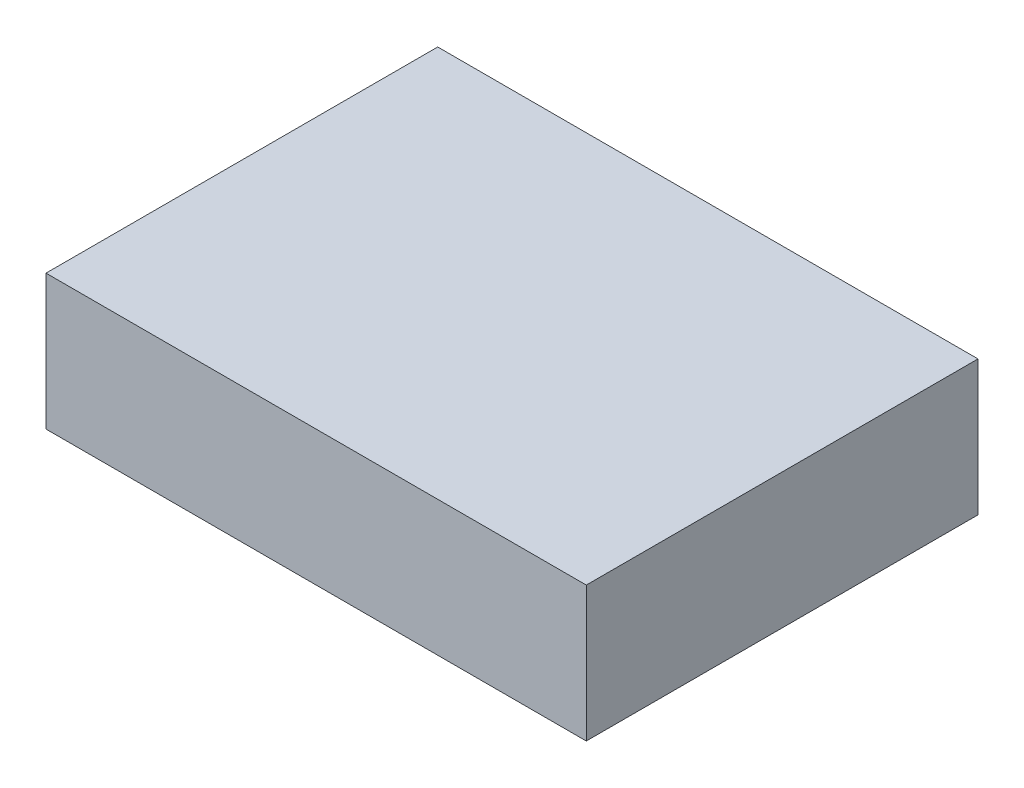
ISO-10303-21;
HEADER;
FILE_DESCRIPTION(('STEP AP214'),'2;1');
FILE_NAME('part.step','',(''),(''),'','','');
FILE_SCHEMA(('AUTOMOTIVE_DESIGN { 1 0 10303 214 1 1 1 1 }'));
ENDSEC;
DATA;
#1=APPLICATION_CONTEXT('core data for automotive mechanical design processes');
#2=APPLICATION_PROTOCOL_DEFINITION('international standard','automotive_design',2000,#1);
#3=PRODUCT_CONTEXT('',#1,'mechanical');
#4=PRODUCT('Part','Part','',(#3));
#5=PRODUCT_RELATED_PRODUCT_CATEGORY('part','',(#4));
#6=PRODUCT_DEFINITION_FORMATION('','',#4);
#7=PRODUCT_DEFINITION_CONTEXT('part definition',#1,'design');
#8=PRODUCT_DEFINITION('design','',#6,#7);
#9=PRODUCT_DEFINITION_SHAPE('','',#8);
#10=(LENGTH_UNIT() NAMED_UNIT(*) SI_UNIT(.MILLI.,.METRE.));
#11=(NAMED_UNIT(*) PLANE_ANGLE_UNIT() SI_UNIT($,.RADIAN.));
#12=(NAMED_UNIT(*) SI_UNIT($,.STERADIAN.) SOLID_ANGLE_UNIT());
#13=UNCERTAINTY_MEASURE_WITH_UNIT(LENGTH_MEASURE(1.E-05),#10,'distance_accuracy_value','');
#14=(GEOMETRIC_REPRESENTATION_CONTEXT(3) GLOBAL_UNCERTAINTY_ASSIGNED_CONTEXT((#13)) GLOBAL_UNIT_ASSIGNED_CONTEXT((#10,
#11,#12)) REPRESENTATION_CONTEXT('',''));
#15=CARTESIAN_POINT('',(0.,0.,0.));
#16=DIRECTION('',(0.,0.,1.));
#17=DIRECTION('',(1.,0.,0.));
#18=AXIS2_PLACEMENT_3D('',#15,#16,#17);
#19=CARTESIAN_POINT('',(0.,-10.,0.));
#20=DIRECTION('',(-1.,0.,0.));
#21=DIRECTION('',(0.,0.,1.));
#22=AXIS2_PLACEMENT_3D('',#19,#20,#21);
#23=PLANE('',#22);
#24=DIRECTION('',(0.,0.,1.));
#25=VECTOR('',#24,1.);
#26=CARTESIAN_POINT('',(0.,0.,0.));
#27=LINE('',#26,#25);
#28=CARTESIAN_POINT('',(0.,0.,-29.));
#29=VERTEX_POINT('',#28);
#30=CARTESIAN_POINT('',(0.,0.,0.));
#31=VERTEX_POINT('',#30);
#32=EDGE_CURVE('E104',#29,#31,#27,.T.);
#33=ORIENTED_EDGE('',*,*,#32,.F.);
#34=DIRECTION('',(0.,1.,0.));
#35=VECTOR('',#34,1.);
#36=CARTESIAN_POINT('',(0.,-10.,-29.));
#37=LINE('',#36,#35);
#38=CARTESIAN_POINT('',(0.,-10.,-29.));
#39=VERTEX_POINT('',#38);
#40=EDGE_CURVE('E11',#39,#29,#37,.T.);
#41=ORIENTED_EDGE('',*,*,#40,.F.);
#42=DIRECTION('',(0.,0.,1.));
#43=VECTOR('',#42,1.);
#44=CARTESIAN_POINT('',(0.,-10.,0.));
#45=LINE('',#44,#43);
#46=CARTESIAN_POINT('',(0.,-10.,0.));
#47=VERTEX_POINT('',#46);
#48=EDGE_CURVE('E100',#39,#47,#45,.T.);
#49=ORIENTED_EDGE('',*,*,#48,.T.);
#50=DIRECTION('',(0.,1.,0.));
#51=VECTOR('',#50,1.);
#52=CARTESIAN_POINT('',(0.,-10.,0.));
#53=LINE('',#52,#51);
#54=EDGE_CURVE('E45',#47,#31,#53,.T.);
#55=ORIENTED_EDGE('',*,*,#54,.T.);
#56=EDGE_LOOP('',(#33,#41,#49,#55));
#57=FACE_BOUND('',#56,.T.);
#58=ADVANCED_FACE('F39',(#57),#23,.T.);
#59=CARTESIAN_POINT('',(0.,-10.,-29.));
#60=DIRECTION('',(0.,0.,-1.));
#61=DIRECTION('',(-1.,0.,0.));
#62=AXIS2_PLACEMENT_3D('',#59,#60,#61);
#63=PLANE('',#62);
#64=DIRECTION('',(-1.,0.,0.));
#65=VECTOR('',#64,1.);
#66=CARTESIAN_POINT('',(0.,0.,-29.));
#67=LINE('',#66,#65);
#68=CARTESIAN_POINT('',(40.,0.,-29.));
#69=VERTEX_POINT('',#68);
#70=EDGE_CURVE('E98',#69,#29,#67,.T.);
#71=ORIENTED_EDGE('',*,*,#70,.F.);
#72=DIRECTION('',(0.,1.,0.));
#73=VECTOR('',#72,1.);
#74=CARTESIAN_POINT('',(40.,-10.,-29.));
#75=LINE('',#74,#73);
#76=CARTESIAN_POINT('',(40.,-10.,-29.));
#77=VERTEX_POINT('',#76);
#78=EDGE_CURVE('E48',#77,#69,#75,.T.);
#79=ORIENTED_EDGE('',*,*,#78,.F.);
#80=DIRECTION('',(-1.,0.,0.));
#81=VECTOR('',#80,1.);
#82=CARTESIAN_POINT('',(0.,-10.,-29.));
#83=LINE('',#82,#81);
#84=EDGE_CURVE('E92',#77,#39,#83,.T.);
#85=ORIENTED_EDGE('',*,*,#84,.T.);
#86=ORIENTED_EDGE('',*,*,#40,.T.);
#87=EDGE_LOOP('',(#71,#79,#85,#86));
#88=FACE_BOUND('',#87,.T.);
#89=ADVANCED_FACE('F111',(#88),#63,.T.);
#90=CARTESIAN_POINT('',(40.,-10.,0.));
#91=DIRECTION('',(1.,0.,0.));
#92=DIRECTION('',(0.,0.,-1.));
#93=AXIS2_PLACEMENT_3D('',#90,#91,#92);
#94=PLANE('',#93);
#95=DIRECTION('',(0.,0.,-1.));
#96=VECTOR('',#95,1.);
#97=CARTESIAN_POINT('',(40.,0.,0.));
#98=LINE('',#97,#96);
#99=CARTESIAN_POINT('',(40.,0.,0.));
#100=VERTEX_POINT('',#99);
#101=EDGE_CURVE('E87',#100,#69,#98,.T.);
#102=ORIENTED_EDGE('',*,*,#101,.F.);
#103=DIRECTION('',(0.,1.,0.));
#104=VECTOR('',#103,1.);
#105=CARTESIAN_POINT('',(40.,-10.,0.));
#106=LINE('',#105,#104);
#107=CARTESIAN_POINT('',(40.,-10.,0.));
#108=VERTEX_POINT('',#107);
#109=EDGE_CURVE('E84',#108,#100,#106,.T.);
#110=ORIENTED_EDGE('',*,*,#109,.F.);
#111=DIRECTION('',(0.,0.,-1.));
#112=VECTOR('',#111,1.);
#113=CARTESIAN_POINT('',(40.,-10.,0.));
#114=LINE('',#113,#112);
#115=EDGE_CURVE('E90',#108,#77,#114,.T.);
#116=ORIENTED_EDGE('',*,*,#115,.T.);
#117=ORIENTED_EDGE('',*,*,#78,.T.);
#118=EDGE_LOOP('',(#102,#110,#116,#117));
#119=FACE_BOUND('',#118,.T.);
#120=ADVANCED_FACE('F86',(#119),#94,.T.);
#121=CARTESIAN_POINT('',(0.,-10.,0.));
#122=DIRECTION('',(0.,0.,1.));
#123=DIRECTION('',(1.,0.,0.));
#124=AXIS2_PLACEMENT_3D('',#121,#122,#123);
#125=PLANE('',#124);
#126=DIRECTION('',(1.,0.,0.));
#127=VECTOR('',#126,1.);
#128=CARTESIAN_POINT('',(0.,0.,0.));
#129=LINE('',#128,#127);
#130=EDGE_CURVE('E106',#31,#100,#129,.T.);
#131=ORIENTED_EDGE('',*,*,#130,.F.);
#132=ORIENTED_EDGE('',*,*,#54,.F.);
#133=DIRECTION('',(1.,0.,0.));
#134=VECTOR('',#133,1.);
#135=CARTESIAN_POINT('',(0.,-10.,0.));
#136=LINE('',#135,#134);
#137=EDGE_CURVE('E93',#47,#108,#136,.T.);
#138=ORIENTED_EDGE('',*,*,#137,.T.);
#139=ORIENTED_EDGE('',*,*,#109,.T.);
#140=EDGE_LOOP('',(#131,#132,#138,#139));
#141=FACE_BOUND('',#140,.T.);
#142=ADVANCED_FACE('F96',(#141),#125,.T.);
#143=CARTESIAN_POINT('',(0.,-10.,0.));
#144=DIRECTION('',(0.,-1.,0.));
#145=DIRECTION('',(0.,0.,-1.));
#146=AXIS2_PLACEMENT_3D('',#143,#144,#145);
#147=PLANE('',#146);
#148=ORIENTED_EDGE('',*,*,#48,.F.);
#149=ORIENTED_EDGE('',*,*,#84,.F.);
#150=ORIENTED_EDGE('',*,*,#115,.F.);
#151=ORIENTED_EDGE('',*,*,#137,.F.);
#152=EDGE_LOOP('',(#148,#149,#150,#151));
#153=FACE_BOUND('',#152,.T.);
#154=ADVANCED_FACE('F95',(#153),#147,.T.);
#155=CARTESIAN_POINT('',(0.,0.,0.));
#156=DIRECTION('',(0.,-1.,0.));
#157=DIRECTION('',(0.,0.,-1.));
#158=AXIS2_PLACEMENT_3D('',#155,#156,#157);
#159=PLANE('',#158);
#160=ORIENTED_EDGE('',*,*,#32,.T.);
#161=ORIENTED_EDGE('',*,*,#130,.T.);
#162=ORIENTED_EDGE('',*,*,#101,.T.);
#163=ORIENTED_EDGE('',*,*,#70,.T.);
#164=EDGE_LOOP('',(#160,#161,#162,#163));
#165=FACE_BOUND('',#164,.T.);
#166=ADVANCED_FACE('F115',(#165),#159,.F.);
#167=CLOSED_SHELL('',(#58,#89,#120,#142,#154,#166));
#168=MANIFOLD_SOLID_BREP('B2',#167);
#169=ADVANCED_BREP_SHAPE_REPRESENTATION('',(#18,#168),#14);
#170=SHAPE_DEFINITION_REPRESENTATION(#9,#169);
ENDSEC;
END-ISO-10303-21;
